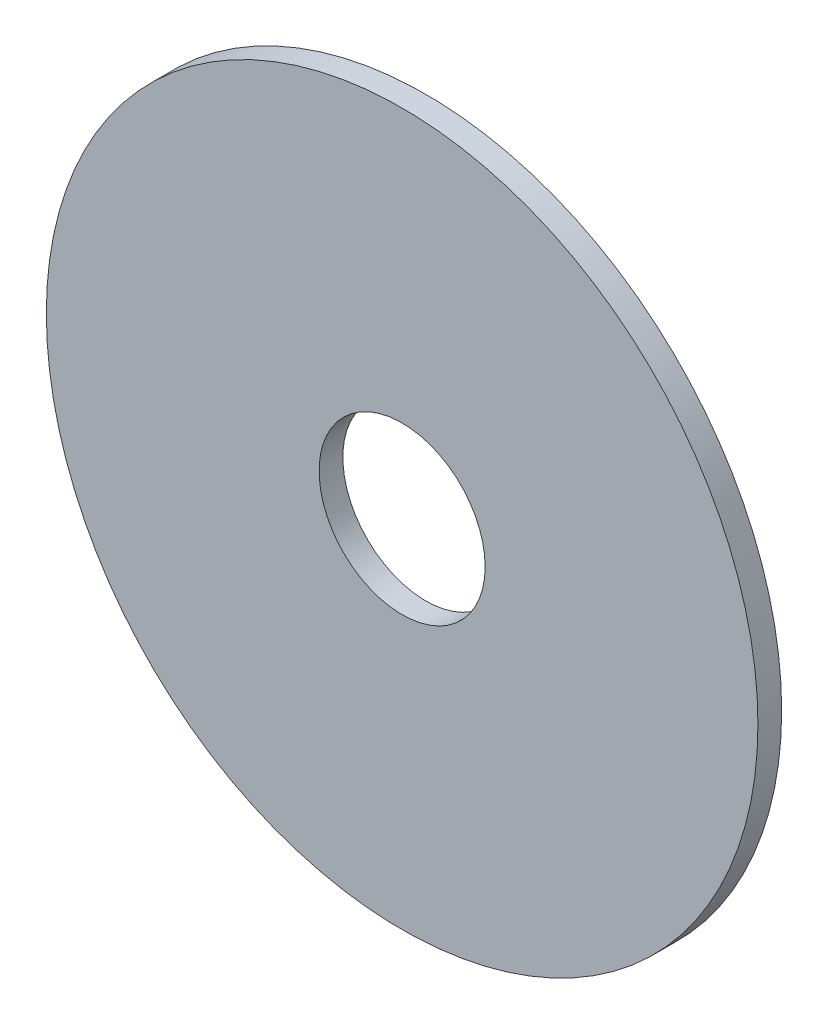
ISO-10303-21;
HEADER;
FILE_DESCRIPTION(('STEP AP214'),'2;1');
FILE_NAME('part.step','',(''),(''),'','','');
FILE_SCHEMA(('AUTOMOTIVE_DESIGN { 1 0 10303 214 1 1 1 1 }'));
ENDSEC;
DATA;
#1=APPLICATION_CONTEXT('core data for automotive mechanical design processes');
#2=APPLICATION_PROTOCOL_DEFINITION('international standard','automotive_design',2000,#1);
#3=PRODUCT_CONTEXT('',#1,'mechanical');
#4=PRODUCT('Part','Part','',(#3));
#5=PRODUCT_RELATED_PRODUCT_CATEGORY('part','',(#4));
#6=PRODUCT_DEFINITION_FORMATION('','',#4);
#7=PRODUCT_DEFINITION_CONTEXT('part definition',#1,'design');
#8=PRODUCT_DEFINITION('design','',#6,#7);
#9=PRODUCT_DEFINITION_SHAPE('','',#8);
#10=(LENGTH_UNIT() NAMED_UNIT(*) SI_UNIT(.MILLI.,.METRE.));
#11=(NAMED_UNIT(*) PLANE_ANGLE_UNIT() SI_UNIT($,.RADIAN.));
#12=(NAMED_UNIT(*) SI_UNIT($,.STERADIAN.) SOLID_ANGLE_UNIT());
#13=UNCERTAINTY_MEASURE_WITH_UNIT(LENGTH_MEASURE(1.E-05),#10,'distance_accuracy_value','');
#14=(GEOMETRIC_REPRESENTATION_CONTEXT(3) GLOBAL_UNCERTAINTY_ASSIGNED_CONTEXT((#13)) GLOBAL_UNIT_ASSIGNED_CONTEXT((#10,
#11,#12)) REPRESENTATION_CONTEXT('',''));
#15=CARTESIAN_POINT('',(0.,0.,0.));
#16=DIRECTION('',(0.,0.,1.));
#17=DIRECTION('',(1.,0.,0.));
#18=AXIS2_PLACEMENT_3D('',#15,#16,#17);
#19=CARTESIAN_POINT('',(0.,0.,1.));
#20=DIRECTION('',(0.,0.,1.));
#21=DIRECTION('',(1.,0.,0.));
#22=AXIS2_PLACEMENT_3D('',#19,#20,#21);
#23=PLANE('',#22);
#24=CARTESIAN_POINT('',(0.,0.,1.));
#25=DIRECTION('',(0.,0.,1.));
#26=DIRECTION('',(1.,0.,0.));
#27=AXIS2_PLACEMENT_3D('',#24,#25,#26);
#28=CIRCLE('',#27,15.);
#29=CARTESIAN_POINT('',(15.,0.,1.));
#30=VERTEX_POINT('',#29);
#31=EDGE_CURVE('E10',#30,#30,#28,.T.);
#32=ORIENTED_EDGE('',*,*,#31,.T.);
#33=EDGE_LOOP('',(#32));
#34=FACE_BOUND('',#33,.T.);
#35=CARTESIAN_POINT('',(0.,0.,1.));
#36=DIRECTION('',(0.,0.,1.));
#37=DIRECTION('',(1.,0.,0.));
#38=AXIS2_PLACEMENT_3D('',#35,#36,#37);
#39=CIRCLE('',#38,3.5);
#40=CARTESIAN_POINT('',(3.5,0.,1.));
#41=VERTEX_POINT('',#40);
#42=EDGE_CURVE('E46',#41,#41,#39,.T.);
#43=ORIENTED_EDGE('',*,*,#42,.F.);
#44=EDGE_LOOP('',(#43));
#45=FACE_BOUND('',#44,.T.);
#46=ADVANCED_FACE('F35',(#34,#45),#23,.T.);
#47=CARTESIAN_POINT('',(0.,0.,0.));
#48=DIRECTION('',(0.,0.,1.));
#49=DIRECTION('',(1.,0.,0.));
#50=AXIS2_PLACEMENT_3D('',#47,#48,#49);
#51=PLANE('',#50);
#52=CARTESIAN_POINT('',(0.,0.,0.));
#53=DIRECTION('',(0.,0.,1.));
#54=DIRECTION('',(1.,0.,0.));
#55=AXIS2_PLACEMENT_3D('',#52,#53,#54);
#56=CIRCLE('',#55,15.);
#57=CARTESIAN_POINT('',(15.,0.,0.));
#58=VERTEX_POINT('',#57);
#59=EDGE_CURVE('E39',#58,#58,#56,.T.);
#60=ORIENTED_EDGE('',*,*,#59,.F.);
#61=EDGE_LOOP('',(#60));
#62=FACE_BOUND('',#61,.T.);
#63=CARTESIAN_POINT('',(0.,0.,0.));
#64=DIRECTION('',(0.,0.,1.));
#65=DIRECTION('',(1.,0.,0.));
#66=AXIS2_PLACEMENT_3D('',#63,#64,#65);
#67=CIRCLE('',#66,3.5);
#68=CARTESIAN_POINT('',(3.5,0.,0.));
#69=VERTEX_POINT('',#68);
#70=EDGE_CURVE('E48',#69,#69,#67,.T.);
#71=ORIENTED_EDGE('',*,*,#70,.T.);
#72=EDGE_LOOP('',(#71));
#73=FACE_BOUND('',#72,.T.);
#74=ADVANCED_FACE('F58',(#62,#73),#51,.F.);
#75=CARTESIAN_POINT('',(0.,0.,1.));
#76=DIRECTION('',(0.,0.,-1.));
#77=DIRECTION('',(-1.,0.,0.));
#78=AXIS2_PLACEMENT_3D('',#75,#76,#77);
#79=CYLINDRICAL_SURFACE('',#78,15.);
#80=ORIENTED_EDGE('',*,*,#31,.F.);
#81=EDGE_LOOP('',(#80));
#82=FACE_BOUND('',#81,.T.);
#83=ORIENTED_EDGE('',*,*,#59,.T.);
#84=EDGE_LOOP('',(#83));
#85=FACE_BOUND('',#84,.T.);
#86=ADVANCED_FACE('F37',(#82,#85),#79,.T.);
#87=CARTESIAN_POINT('',(0.,0.,1.));
#88=DIRECTION('',(0.,0.,-1.));
#89=DIRECTION('',(-1.,0.,0.));
#90=AXIS2_PLACEMENT_3D('',#87,#88,#89);
#91=CYLINDRICAL_SURFACE('',#90,3.5);
#92=ORIENTED_EDGE('',*,*,#42,.T.);
#93=EDGE_LOOP('',(#92));
#94=FACE_BOUND('',#93,.T.);
#95=ORIENTED_EDGE('',*,*,#70,.F.);
#96=EDGE_LOOP('',(#95));
#97=FACE_BOUND('',#96,.T.);
#98=ADVANCED_FACE('F54',(#94,#97),#91,.F.);
#99=CLOSED_SHELL('',(#46,#74,#86,#98));
#100=MANIFOLD_SOLID_BREP('B2',#99);
#101=ADVANCED_BREP_SHAPE_REPRESENTATION('',(#18,#100),#14);
#102=SHAPE_DEFINITION_REPRESENTATION(#9,#101);
ENDSEC;
END-ISO-10303-21;
